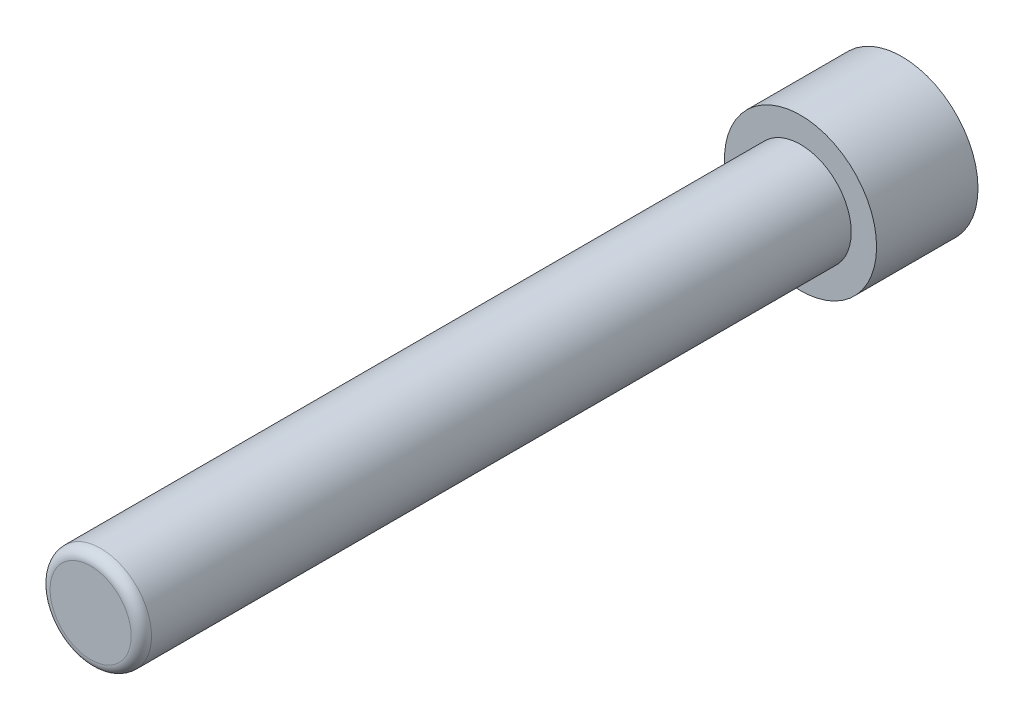
ISO-10303-21;
HEADER;
FILE_DESCRIPTION(('STEP AP214'),'2;1');
FILE_NAME('part.step','',(''),(''),'','','');
FILE_SCHEMA(('AUTOMOTIVE_DESIGN { 1 0 10303 214 1 1 1 1 }'));
ENDSEC;
DATA;
#1=APPLICATION_CONTEXT('core data for automotive mechanical design processes');
#2=APPLICATION_PROTOCOL_DEFINITION('international standard','automotive_design',2000,#1);
#3=PRODUCT_CONTEXT('',#1,'mechanical');
#4=PRODUCT('Part','Part','',(#3));
#5=PRODUCT_RELATED_PRODUCT_CATEGORY('part','',(#4));
#6=PRODUCT_DEFINITION_FORMATION('','',#4);
#7=PRODUCT_DEFINITION_CONTEXT('part definition',#1,'design');
#8=PRODUCT_DEFINITION('design','',#6,#7);
#9=PRODUCT_DEFINITION_SHAPE('','',#8);
#10=(LENGTH_UNIT() NAMED_UNIT(*) SI_UNIT(.MILLI.,.METRE.));
#11=(NAMED_UNIT(*) PLANE_ANGLE_UNIT() SI_UNIT($,.RADIAN.));
#12=(NAMED_UNIT(*) SI_UNIT($,.STERADIAN.) SOLID_ANGLE_UNIT());
#13=UNCERTAINTY_MEASURE_WITH_UNIT(LENGTH_MEASURE(1.E-05),#10,'distance_accuracy_value','');
#14=(GEOMETRIC_REPRESENTATION_CONTEXT(3) GLOBAL_UNCERTAINTY_ASSIGNED_CONTEXT((#13)) GLOBAL_UNIT_ASSIGNED_CONTEXT((#10,
#11,#12)) REPRESENTATION_CONTEXT('',''));
#15=CARTESIAN_POINT('',(0.,0.,0.));
#16=DIRECTION('',(0.,0.,1.));
#17=DIRECTION('',(1.,0.,0.));
#18=AXIS2_PLACEMENT_3D('',#15,#16,#17);
#19=CARTESIAN_POINT('',(0.,0.,25.4));
#20=DIRECTION('',(0.,0.,1.));
#21=DIRECTION('',(1.,0.,0.));
#22=AXIS2_PLACEMENT_3D('',#19,#20,#21);
#23=PLANE('',#22);
#24=CARTESIAN_POINT('',(0.,0.,25.4));
#25=DIRECTION('',(0.,0.,1.));
#26=DIRECTION('',(1.,0.,0.));
#27=AXIS2_PLACEMENT_3D('',#24,#25,#26);
#28=CIRCLE('',#27,19.05);
#29=CARTESIAN_POINT('',(19.05,0.,25.4));
#30=VERTEX_POINT('',#29);
#31=EDGE_CURVE('E43',#30,#30,#28,.T.);
#32=ORIENTED_EDGE('',*,*,#31,.T.);
#33=EDGE_LOOP('',(#32));
#34=FACE_BOUND('',#33,.T.);
#35=CARTESIAN_POINT('',(0.,0.,25.4));
#36=DIRECTION('',(0.,0.,1.));
#37=DIRECTION('',(1.,0.,0.));
#38=AXIS2_PLACEMENT_3D('',#35,#36,#37);
#39=CIRCLE('',#38,12.7);
#40=CARTESIAN_POINT('',(12.7,0.,25.4));
#41=VERTEX_POINT('',#40);
#42=EDGE_CURVE('E51',#41,#41,#39,.T.);
#43=ORIENTED_EDGE('',*,*,#42,.F.);
#44=EDGE_LOOP('',(#43));
#45=FACE_BOUND('',#44,.T.);
#46=ADVANCED_FACE('F32',(#34,#45),#23,.T.);
#47=CARTESIAN_POINT('',(0.,0.,25.4));
#48=DIRECTION('',(0.,0.,-1.));
#49=DIRECTION('',(-1.,0.,0.));
#50=AXIS2_PLACEMENT_3D('',#47,#48,#49);
#51=CYLINDRICAL_SURFACE('',#50,19.05);
#52=ORIENTED_EDGE('',*,*,#31,.F.);
#53=EDGE_LOOP('',(#52));
#54=FACE_BOUND('',#53,.T.);
#55=CARTESIAN_POINT('',(0.,0.,0.));
#56=DIRECTION('',(0.,0.,1.));
#57=DIRECTION('',(1.,0.,0.));
#58=AXIS2_PLACEMENT_3D('',#55,#56,#57);
#59=CIRCLE('',#58,19.05);
#60=CARTESIAN_POINT('',(19.05,0.,0.));
#61=VERTEX_POINT('',#60);
#62=EDGE_CURVE('E47',#61,#61,#59,.T.);
#63=ORIENTED_EDGE('',*,*,#62,.T.);
#64=EDGE_LOOP('',(#63));
#65=FACE_BOUND('',#64,.T.);
#66=ADVANCED_FACE('F59',(#54,#65),#51,.T.);
#67=CARTESIAN_POINT('',(0.,0.,0.));
#68=DIRECTION('',(0.,0.,1.));
#69=DIRECTION('',(1.,0.,0.));
#70=AXIS2_PLACEMENT_3D('',#67,#68,#69);
#71=PLANE('',#70);
#72=ORIENTED_EDGE('',*,*,#62,.F.);
#73=EDGE_LOOP('',(#72));
#74=FACE_BOUND('',#73,.T.);
#75=ADVANCED_FACE('F65',(#74),#71,.F.);
#76=CARTESIAN_POINT('',(0.,0.,203.2));
#77=DIRECTION('',(0.,0.,-1.));
#78=DIRECTION('',(-1.,0.,0.));
#79=AXIS2_PLACEMENT_3D('',#76,#77,#78);
#80=CYLINDRICAL_SURFACE('',#79,12.7);
#81=CARTESIAN_POINT('',(0.,0.,200.66));
#82=DIRECTION('',(0.,0.,1.));
#83=DIRECTION('',(1.,0.,0.));
#84=AXIS2_PLACEMENT_3D('',#81,#82,#83);
#85=CIRCLE('',#84,12.7);
#86=CARTESIAN_POINT('',(12.7,0.,200.66));
#87=VERTEX_POINT('',#86);
#88=EDGE_CURVE('E10',#87,#87,#85,.F.);
#89=ORIENTED_EDGE('',*,*,#88,.T.);
#90=EDGE_LOOP('',(#89));
#91=FACE_BOUND('',#90,.T.);
#92=ORIENTED_EDGE('',*,*,#42,.T.);
#93=EDGE_LOOP('',(#92));
#94=FACE_BOUND('',#93,.T.);
#95=ADVANCED_FACE('F56',(#91,#94),#80,.T.);
#96=CARTESIAN_POINT('',(0.,0.,203.2));
#97=DIRECTION('',(0.,0.,1.));
#98=DIRECTION('',(1.,0.,0.));
#99=AXIS2_PLACEMENT_3D('',#96,#97,#98);
#100=PLANE('',#99);
#101=CARTESIAN_POINT('',(0.,0.,203.2));
#102=DIRECTION('',(0.,0.,1.));
#103=DIRECTION('',(1.,0.,0.));
#104=AXIS2_PLACEMENT_3D('',#101,#102,#103);
#105=CIRCLE('',#104,10.16);
#106=CARTESIAN_POINT('',(10.16,0.,203.2));
#107=VERTEX_POINT('',#106);
#108=EDGE_CURVE('E39',#107,#107,#105,.T.);
#109=ORIENTED_EDGE('',*,*,#108,.T.);
#110=EDGE_LOOP('',(#109));
#111=FACE_BOUND('',#110,.T.);
#112=ADVANCED_FACE('F75',(#111),#100,.T.);
#113=CARTESIAN_POINT('',(0.,0.,200.66));
#114=DIRECTION('',(0.,0.,1.));
#115=DIRECTION('',(1.,0.,0.));
#116=AXIS2_PLACEMENT_3D('',#113,#114,#115);
#117=TOROIDAL_SURFACE('',#116,10.16,2.54);
#118=ORIENTED_EDGE('',*,*,#88,.F.);
#119=EDGE_LOOP('',(#118));
#120=FACE_BOUND('',#119,.T.);
#121=ORIENTED_EDGE('',*,*,#108,.F.);
#122=EDGE_LOOP('',(#121));
#123=FACE_BOUND('',#122,.T.);
#124=ADVANCED_FACE('F34',(#120,#123),#117,.T.);
#125=CLOSED_SHELL('',(#46,#66,#75,#95,#112,#124));
#126=MANIFOLD_SOLID_BREP('B2',#125);
#127=ADVANCED_BREP_SHAPE_REPRESENTATION('',(#18,#126),#14);
#128=SHAPE_DEFINITION_REPRESENTATION(#9,#127);
ENDSEC;
END-ISO-10303-21;
